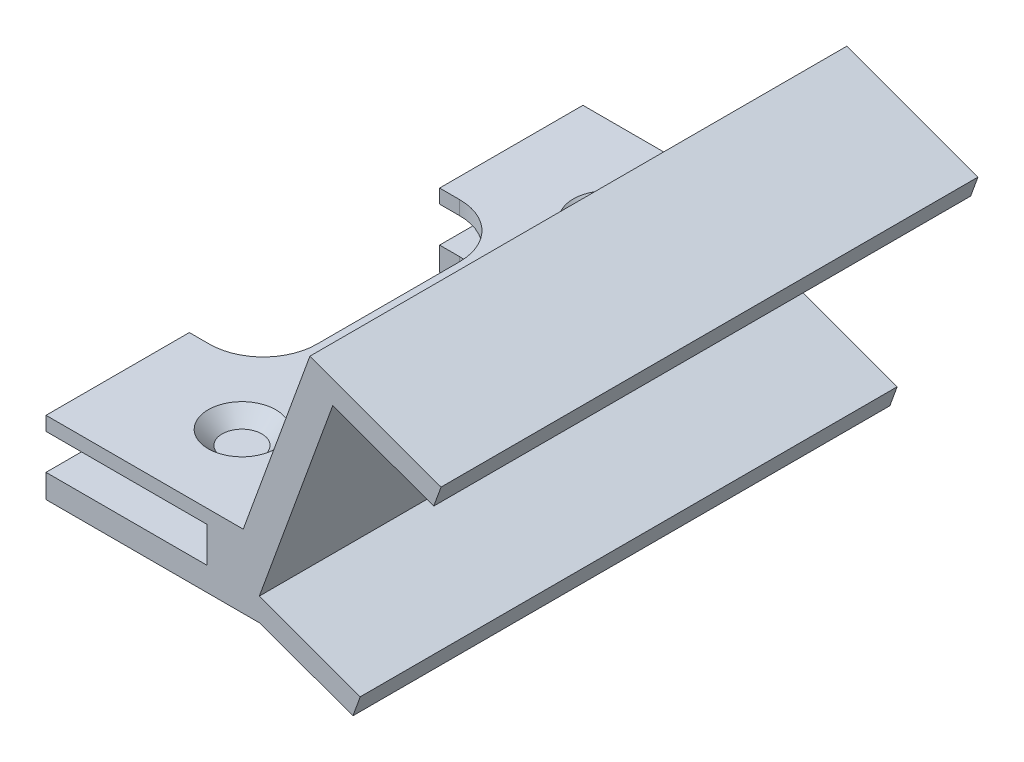
ISO-10303-21;
HEADER;
FILE_DESCRIPTION(('STEP AP214'),'2;1');
FILE_NAME('part.step','',(''),(''),'','','');
FILE_SCHEMA(('AUTOMOTIVE_DESIGN { 1 0 10303 214 1 1 1 1 }'));
ENDSEC;
DATA;
#1=APPLICATION_CONTEXT('core data for automotive mechanical design processes');
#2=APPLICATION_PROTOCOL_DEFINITION('international standard','automotive_design',2000,#1);
#3=PRODUCT_CONTEXT('',#1,'mechanical');
#4=PRODUCT('Part','Part','',(#3));
#5=PRODUCT_RELATED_PRODUCT_CATEGORY('part','',(#4));
#6=PRODUCT_DEFINITION_FORMATION('','',#4);
#7=PRODUCT_DEFINITION_CONTEXT('part definition',#1,'design');
#8=PRODUCT_DEFINITION('design','',#6,#7);
#9=PRODUCT_DEFINITION_SHAPE('','',#8);
#10=(LENGTH_UNIT() NAMED_UNIT(*) SI_UNIT(.MILLI.,.METRE.));
#11=(NAMED_UNIT(*) PLANE_ANGLE_UNIT() SI_UNIT($,.RADIAN.));
#12=(NAMED_UNIT(*) SI_UNIT($,.STERADIAN.) SOLID_ANGLE_UNIT());
#13=UNCERTAINTY_MEASURE_WITH_UNIT(LENGTH_MEASURE(1.E-05),#10,'distance_accuracy_value','');
#14=(GEOMETRIC_REPRESENTATION_CONTEXT(3) GLOBAL_UNCERTAINTY_ASSIGNED_CONTEXT((#13)) GLOBAL_UNIT_ASSIGNED_CONTEXT((#10,
#11,#12)) REPRESENTATION_CONTEXT('',''));
#15=CARTESIAN_POINT('',(0.,0.,0.));
#16=DIRECTION('',(0.,0.,1.));
#17=DIRECTION('',(1.,0.,0.));
#18=AXIS2_PLACEMENT_3D('',#15,#16,#17);
#19=CARTESIAN_POINT('',(10.8861694216917,21.6408290137137,50.));
#20=DIRECTION('',(1.,0.,0.));
#21=DIRECTION('',(0.,1.,0.));
#22=AXIS2_PLACEMENT_3D('',#19,#20,#21);
#23=PLANE('',#22);
#24=DIRECTION('',(0.,0.,-1.));
#25=VECTOR('',#24,1.);
#26=CARTESIAN_POINT('',(10.8861694216917,21.6408290137137,50.));
#27=LINE('',#26,#25);
#28=CARTESIAN_POINT('',(10.8861694216917,21.6408290137137,50.));
#29=VERTEX_POINT('',#28);
#30=CARTESIAN_POINT('',(10.8861694216917,21.6408290137137,36.6524051854797));
#31=VERTEX_POINT('',#30);
#32=EDGE_CURVE('E411',#29,#31,#27,.T.);
#33=ORIENTED_EDGE('',*,*,#32,.T.);
#34=DIRECTION('',(0.,-1.,0.));
#35=VECTOR('',#34,1.);
#36=CARTESIAN_POINT('',(10.8861694216917,21.6408290137137,36.6524051854797));
#37=LINE('',#36,#35);
#38=CARTESIAN_POINT('',(10.8861694216917,19.4408290137137,36.6524051854797));
#39=VERTEX_POINT('',#38);
#40=EDGE_CURVE('E229',#31,#39,#37,.T.);
#41=ORIENTED_EDGE('',*,*,#40,.T.);
#42=DIRECTION('',(0.,0.,-1.));
#43=VECTOR('',#42,1.);
#44=CARTESIAN_POINT('',(10.8861694216917,19.4408290137137,50.));
#45=LINE('',#44,#43);
#46=CARTESIAN_POINT('',(10.8861694216917,19.4408290137137,50.));
#47=VERTEX_POINT('',#46);
#48=EDGE_CURVE('E273',#47,#39,#45,.T.);
#49=ORIENTED_EDGE('',*,*,#48,.F.);
#50=DIRECTION('',(0.,-1.,0.));
#51=VECTOR('',#50,1.);
#52=CARTESIAN_POINT('',(10.8861694216917,21.6408290137137,50.));
#53=LINE('',#52,#51);
#54=EDGE_CURVE('E410',#29,#47,#53,.T.);
#55=ORIENTED_EDGE('',*,*,#54,.F.);
#56=EDGE_LOOP('',(#33,#41,#49,#55));
#57=FACE_BOUND('',#56,.T.);
#58=ADVANCED_FACE('F34',(#57),#23,.F.);
#59=CARTESIAN_POINT('',(10.8861694216917,26.2408290137137,50.));
#60=DIRECTION('',(1.,0.,0.));
#61=DIRECTION('',(0.,0.,-1.));
#62=AXIS2_PLACEMENT_3D('',#59,#60,#61);
#63=PLANE('',#62);
#64=DIRECTION('',(0.,0.,-1.));
#65=VECTOR('',#64,1.);
#66=CARTESIAN_POINT('',(10.8861694216917,26.2408290137137,50.));
#67=LINE('',#66,#65);
#68=CARTESIAN_POINT('',(10.8861694216917,26.2408290137137,50.));
#69=VERTEX_POINT('',#68);
#70=CARTESIAN_POINT('',(10.8861694216917,26.2408290137137,36.6524051854797));
#71=VERTEX_POINT('',#70);
#72=EDGE_CURVE('E238',#69,#71,#67,.T.);
#73=ORIENTED_EDGE('',*,*,#72,.T.);
#74=DIRECTION('',(0.,-1.,0.));
#75=VECTOR('',#74,1.);
#76=CARTESIAN_POINT('',(10.8861694216917,26.2408290137137,36.6524051854797));
#77=LINE('',#76,#75);
#78=CARTESIAN_POINT('',(10.8861694216917,24.9408290137137,36.6524051854797));
#79=VERTEX_POINT('',#78);
#80=EDGE_CURVE('E477',#71,#79,#77,.T.);
#81=ORIENTED_EDGE('',*,*,#80,.T.);
#82=DIRECTION('',(0.,0.,-1.));
#83=VECTOR('',#82,1.);
#84=CARTESIAN_POINT('',(10.8861694216917,24.9408290137137,50.));
#85=LINE('',#84,#83);
#86=CARTESIAN_POINT('',(10.8861694216917,24.9408290137137,50.));
#87=VERTEX_POINT('',#86);
#88=EDGE_CURVE('E239',#87,#79,#85,.T.);
#89=ORIENTED_EDGE('',*,*,#88,.F.);
#90=DIRECTION('',(0.,-1.,0.));
#91=VECTOR('',#90,1.);
#92=CARTESIAN_POINT('',(10.8861694216917,26.2408290137137,50.));
#93=LINE('',#92,#91);
#94=EDGE_CURVE('E439',#69,#87,#93,.T.);
#95=ORIENTED_EDGE('',*,*,#94,.F.);
#96=EDGE_LOOP('',(#73,#81,#89,#95));
#97=FACE_BOUND('',#96,.T.);
#98=ADVANCED_FACE('F340',(#97),#63,.F.);
#99=CARTESIAN_POINT('',(10.8861694216917,19.4408290137137,13.3475948145203));
#100=VERTEX_POINT('',#99);
#101=CARTESIAN_POINT('',(10.8861694216917,19.4408290137137,0.));
#102=VERTEX_POINT('',#101);
#103=EDGE_CURVE('E272',#100,#102,#45,.T.);
#104=ORIENTED_EDGE('',*,*,#103,.F.);
#105=DIRECTION('',(0.,1.,0.));
#106=VECTOR('',#105,1.);
#107=CARTESIAN_POINT('',(10.8861694216917,21.6408290137137,13.3475948145203));
#108=LINE('',#107,#106);
#109=CARTESIAN_POINT('',(10.8861694216917,21.6408290137137,13.3475948145203));
#110=VERTEX_POINT('',#109);
#111=EDGE_CURVE('E364',#100,#110,#108,.T.);
#112=ORIENTED_EDGE('',*,*,#111,.T.);
#113=CARTESIAN_POINT('',(10.8861694216917,21.6408290137137,0.));
#114=VERTEX_POINT('',#113);
#115=EDGE_CURVE('E414',#110,#114,#27,.T.);
#116=ORIENTED_EDGE('',*,*,#115,.T.);
#117=DIRECTION('',(0.,-1.,0.));
#118=VECTOR('',#117,1.);
#119=CARTESIAN_POINT('',(10.8861694216917,21.6408290137137,0.));
#120=LINE('',#119,#118);
#121=EDGE_CURVE('E367',#114,#102,#120,.T.);
#122=ORIENTED_EDGE('',*,*,#121,.T.);
#123=EDGE_LOOP('',(#104,#112,#116,#122));
#124=FACE_BOUND('',#123,.T.);
#125=ADVANCED_FACE('F343',(#124),#23,.F.);
#126=CARTESIAN_POINT('',(10.8861694216917,19.4408290137137,50.));
#127=DIRECTION('',(0.,1.,0.));
#128=DIRECTION('',(0.,0.,1.));
#129=AXIS2_PLACEMENT_3D('',#126,#127,#128);
#130=PLANE('',#129);
#131=CARTESIAN_POINT('',(21.1361694216917,19.4408290137137,8.));
#132=DIRECTION('',(0.,1.,0.));
#133=DIRECTION('',(0.,0.,1.));
#134=AXIS2_PLACEMENT_3D('',#131,#132,#133);
#135=CIRCLE('',#134,1.7);
#136=CARTESIAN_POINT('',(21.1361694216917,19.4408290137137,9.7));
#137=VERTEX_POINT('',#136);
#138=EDGE_CURVE('E285',#137,#137,#135,.T.);
#139=ORIENTED_EDGE('',*,*,#138,.T.);
#140=EDGE_LOOP('',(#139));
#141=FACE_BOUND('',#140,.T.);
#142=CARTESIAN_POINT('',(21.1361694216917,19.4408290137137,42.));
#143=DIRECTION('',(0.,1.,0.));
#144=DIRECTION('',(0.,0.,1.));
#145=AXIS2_PLACEMENT_3D('',#142,#143,#144);
#146=CIRCLE('',#145,1.7);
#147=CARTESIAN_POINT('',(21.1361694216917,19.4408290137137,43.7));
#148=VERTEX_POINT('',#147);
#149=EDGE_CURVE('E280',#148,#148,#146,.T.);
#150=ORIENTED_EDGE('',*,*,#149,.T.);
#151=EDGE_LOOP('',(#150));
#152=FACE_BOUND('',#151,.T.);
#153=ORIENTED_EDGE('',*,*,#48,.T.);
#154=DIRECTION('',(1.,0.,0.));
#155=VECTOR('',#154,1.);
#156=CARTESIAN_POINT('',(10.8861694216917,19.4408290137137,36.6524051854797));
#157=LINE('',#156,#155);
#158=CARTESIAN_POINT('',(12.7611694216917,19.4408290137137,36.6524051854797));
#159=VERTEX_POINT('',#158);
#160=EDGE_CURVE('E483',#39,#159,#157,.T.);
#161=ORIENTED_EDGE('',*,*,#160,.T.);
#162=CARTESIAN_POINT('',(12.7611694216917,19.4408290137137,31.6524051854797));
#163=DIRECTION('',(0.,1.,0.));
#164=DIRECTION('',(0.,0.,1.));
#165=AXIS2_PLACEMENT_3D('',#162,#163,#164);
#166=CIRCLE('',#165,5.);
#167=CARTESIAN_POINT('',(17.7611694216917,19.4408290137137,31.6524051854797));
#168=VERTEX_POINT('',#167);
#169=EDGE_CURVE('E317',#159,#168,#166,.T.);
#170=ORIENTED_EDGE('',*,*,#169,.T.);
#171=DIRECTION('',(0.,0.,-1.));
#172=VECTOR('',#171,1.);
#173=CARTESIAN_POINT('',(17.7611694216917,19.4408290137137,50.));
#174=LINE('',#173,#172);
#175=CARTESIAN_POINT('',(17.7611694216917,19.4408290137137,18.3475948145203));
#176=VERTEX_POINT('',#175);
#177=EDGE_CURVE('E472',#168,#176,#174,.T.);
#178=ORIENTED_EDGE('',*,*,#177,.T.);
#179=CARTESIAN_POINT('',(12.7611694216917,19.4408290137137,18.3475948145203));
#180=DIRECTION('',(0.,1.,0.));
#181=DIRECTION('',(0.,0.,1.));
#182=AXIS2_PLACEMENT_3D('',#179,#180,#181);
#183=CIRCLE('',#182,5.);
#184=CARTESIAN_POINT('',(12.7611694216917,19.4408290137137,13.3475948145203));
#185=VERTEX_POINT('',#184);
#186=EDGE_CURVE('E325',#176,#185,#183,.T.);
#187=ORIENTED_EDGE('',*,*,#186,.T.);
#188=DIRECTION('',(-1.,0.,0.));
#189=VECTOR('',#188,1.);
#190=CARTESIAN_POINT('',(10.8861694216917,19.4408290137137,13.3475948145203));
#191=LINE('',#190,#189);
#192=EDGE_CURVE('E373',#185,#100,#191,.T.);
#193=ORIENTED_EDGE('',*,*,#192,.T.);
#194=ORIENTED_EDGE('',*,*,#103,.T.);
#195=DIRECTION('',(1.,0.,0.));
#196=VECTOR('',#195,1.);
#197=CARTESIAN_POINT('',(10.8861694216917,19.4408290137137,0.));
#198=LINE('',#197,#196);
#199=CARTESIAN_POINT('',(30.820361380704,19.4408290137137,0.));
#200=VERTEX_POINT('',#199);
#201=EDGE_CURVE('E371',#102,#200,#198,.T.);
#202=ORIENTED_EDGE('',*,*,#201,.T.);
#203=DIRECTION('',(0.,0.,-1.));
#204=VECTOR('',#203,1.);
#205=CARTESIAN_POINT('',(30.820361380704,19.4408290137137,50.));
#206=LINE('',#205,#204);
#207=CARTESIAN_POINT('',(30.820361380704,19.4408290137137,50.));
#208=VERTEX_POINT('',#207);
#209=EDGE_CURVE('E269',#208,#200,#206,.T.);
#210=ORIENTED_EDGE('',*,*,#209,.F.);
#211=DIRECTION('',(1.,0.,0.));
#212=VECTOR('',#211,1.);
#213=CARTESIAN_POINT('',(10.8861694216917,19.4408290137137,50.));
#214=LINE('',#213,#212);
#215=EDGE_CURVE('E459',#47,#208,#214,.T.);
#216=ORIENTED_EDGE('',*,*,#215,.F.);
#217=EDGE_LOOP('',(#153,#161,#170,#178,#187,#193,#194,#202,#210,#216));
#218=FACE_BOUND('',#217,.T.);
#219=ADVANCED_FACE('F353',(#141,#152,#218),#130,.F.);
#220=CARTESIAN_POINT('',(30.820361380704,19.4408290137137,50.));
#221=DIRECTION('',(0.34202014332567,0.939692620785908,0.));
#222=DIRECTION('',(-0.939692620785908,0.34202014332567,0.));
#223=AXIS2_PLACEMENT_3D('',#220,#221,#222);
#224=PLANE('',#223);
#225=DIRECTION('',(0.939692620785908,-0.34202014332567,0.));
#226=VECTOR('',#225,1.);
#227=CARTESIAN_POINT('',(30.820361380704,19.4408290137137,0.));
#228=LINE('',#227,#226);
#229=CARTESIAN_POINT('',(39.4657370752283,16.2941695968583,0.));
#230=VERTEX_POINT('',#229);
#231=EDGE_CURVE('E379',#200,#230,#228,.T.);
#232=ORIENTED_EDGE('',*,*,#231,.T.);
#233=DIRECTION('',(0.,0.,-1.));
#234=VECTOR('',#233,1.);
#235=CARTESIAN_POINT('',(39.4657370752283,16.2941695968583,50.));
#236=LINE('',#235,#234);
#237=CARTESIAN_POINT('',(39.4657370752283,16.2941695968583,50.));
#238=VERTEX_POINT('',#237);
#239=EDGE_CURVE('E266',#238,#230,#236,.T.);
#240=ORIENTED_EDGE('',*,*,#239,.F.);
#241=DIRECTION('',(0.939692620785908,-0.34202014332567,0.));
#242=VECTOR('',#241,1.);
#243=CARTESIAN_POINT('',(30.820361380704,19.4408290137137,50.));
#244=LINE('',#243,#242);
#245=EDGE_CURVE('E457',#208,#238,#244,.T.);
#246=ORIENTED_EDGE('',*,*,#245,.F.);
#247=ORIENTED_EDGE('',*,*,#209,.T.);
#248=EDGE_LOOP('',(#232,#240,#246,#247));
#249=FACE_BOUND('',#248,.T.);
#250=ADVANCED_FACE('F358',(#249),#224,.F.);
#251=CARTESIAN_POINT('',(39.4657370752283,16.2941695968583,50.));
#252=DIRECTION('',(-0.93969262078591,0.342020143325666,0.));
#253=DIRECTION('',(-0.342020143325666,-0.93969262078591,0.));
#254=AXIS2_PLACEMENT_3D('',#251,#252,#253);
#255=PLANE('',#254);
#256=DIRECTION('',(0.342020143325666,0.939692620785909,0.));
#257=VECTOR('',#256,1.);
#258=CARTESIAN_POINT('',(39.4657370752283,16.2941695968583,0.));
#259=LINE('',#258,#257);
#260=CARTESIAN_POINT('',(40.1497773618796,18.1735548384301,0.));
#261=VERTEX_POINT('',#260);
#262=EDGE_CURVE('E381',#230,#261,#259,.T.);
#263=ORIENTED_EDGE('',*,*,#262,.T.);
#264=DIRECTION('',(0.,0.,-1.));
#265=VECTOR('',#264,1.);
#266=CARTESIAN_POINT('',(40.1497773618796,18.1735548384301,50.));
#267=LINE('',#266,#265);
#268=CARTESIAN_POINT('',(40.1497773618796,18.1735548384301,50.));
#269=VERTEX_POINT('',#268);
#270=EDGE_CURVE('E263',#269,#261,#267,.T.);
#271=ORIENTED_EDGE('',*,*,#270,.F.);
#272=DIRECTION('',(0.342020143325666,0.939692620785909,0.));
#273=VECTOR('',#272,1.);
#274=CARTESIAN_POINT('',(39.4657370752283,16.2941695968583,50.));
#275=LINE('',#274,#273);
#276=EDGE_CURVE('E455',#238,#269,#275,.T.);
#277=ORIENTED_EDGE('',*,*,#276,.F.);
#278=ORIENTED_EDGE('',*,*,#239,.T.);
#279=EDGE_LOOP('',(#263,#271,#277,#278));
#280=FACE_BOUND('',#279,.T.);
#281=ADVANCED_FACE('F537',(#280),#255,.F.);
#282=CARTESIAN_POINT('',(40.1497773618796,18.1735548384301,50.));
#283=DIRECTION('',(-0.342020143325664,-0.93969262078591,0.));
#284=DIRECTION('',(0.93969262078591,-0.342020143325664,0.));
#285=AXIS2_PLACEMENT_3D('',#282,#283,#284);
#286=PLANE('',#285);
#287=DIRECTION('',(-0.93969262078591,0.342020143325664,0.));
#288=VECTOR('',#287,1.);
#289=CARTESIAN_POINT('',(40.1497773618796,18.1735548384301,0.));
#290=LINE('',#289,#288);
#291=CARTESIAN_POINT('',(30.7528511540205,21.5937562716868,0.));
#292=VERTEX_POINT('',#291);
#293=EDGE_CURVE('E388',#261,#292,#290,.T.);
#294=ORIENTED_EDGE('',*,*,#293,.T.);
#295=DIRECTION('',(0.,0.,-1.));
#296=VECTOR('',#295,1.);
#297=CARTESIAN_POINT('',(30.7528511540205,21.5937562716868,50.));
#298=LINE('',#297,#296);
#299=CARTESIAN_POINT('',(30.7528511540205,21.5937562716868,50.));
#300=VERTEX_POINT('',#299);
#301=EDGE_CURVE('E260',#300,#292,#298,.T.);
#302=ORIENTED_EDGE('',*,*,#301,.F.);
#303=DIRECTION('',(-0.93969262078591,0.342020143325664,0.));
#304=VECTOR('',#303,1.);
#305=CARTESIAN_POINT('',(40.1497773618796,18.1735548384301,50.));
#306=LINE('',#305,#304);
#307=EDGE_CURVE('E453',#269,#300,#306,.T.);
#308=ORIENTED_EDGE('',*,*,#307,.F.);
#309=ORIENTED_EDGE('',*,*,#270,.T.);
#310=EDGE_LOOP('',(#294,#302,#308,#309));
#311=FACE_BOUND('',#310,.T.);
#312=ADVANCED_FACE('F533',(#311),#286,.F.);
#313=CARTESIAN_POINT('',(30.7528511540205,21.5937562716868,50.));
#314=DIRECTION('',(-0.93969262078591,0.342020143325664,0.));
#315=DIRECTION('',(-0.342020143325664,-0.93969262078591,0.));
#316=AXIS2_PLACEMENT_3D('',#313,#314,#315);
#317=PLANE('',#316);
#318=DIRECTION('',(0.342020143325664,0.93969262078591,0.));
#319=VECTOR('',#318,1.);
#320=CARTESIAN_POINT('',(30.7528511540205,21.5937562716868,0.));
#321=LINE('',#320,#319);
#322=CARTESIAN_POINT('',(37.5932540205338,40.387608687405,0.));
#323=VERTEX_POINT('',#322);
#324=EDGE_CURVE('E390',#292,#323,#321,.T.);
#325=ORIENTED_EDGE('',*,*,#324,.T.);
#326=DIRECTION('',(0.,0.,-1.));
#327=VECTOR('',#326,1.);
#328=CARTESIAN_POINT('',(37.5932540205338,40.387608687405,50.));
#329=LINE('',#328,#327);
#330=CARTESIAN_POINT('',(37.5932540205338,40.387608687405,50.));
#331=VERTEX_POINT('',#330);
#332=EDGE_CURVE('E257',#331,#323,#329,.T.);
#333=ORIENTED_EDGE('',*,*,#332,.F.);
#334=DIRECTION('',(0.342020143325664,0.93969262078591,0.));
#335=VECTOR('',#334,1.);
#336=CARTESIAN_POINT('',(30.7528511540205,21.5937562716868,50.));
#337=LINE('',#336,#335);
#338=EDGE_CURVE('E451',#300,#331,#337,.T.);
#339=ORIENTED_EDGE('',*,*,#338,.F.);
#340=ORIENTED_EDGE('',*,*,#301,.T.);
#341=EDGE_LOOP('',(#325,#333,#339,#340));
#342=FACE_BOUND('',#341,.T.);
#343=ADVANCED_FACE('F528',(#342),#317,.F.);
#344=CARTESIAN_POINT('',(37.5932540205338,40.387608687405,50.));
#345=DIRECTION('',(0.342020143325664,0.93969262078591,0.));
#346=DIRECTION('',(-0.93969262078591,0.342020143325664,0.));
#347=AXIS2_PLACEMENT_3D('',#344,#345,#346);
#348=PLANE('',#347);
#349=DIRECTION('',(0.93969262078591,-0.342020143325664,0.));
#350=VECTOR('',#349,1.);
#351=CARTESIAN_POINT('',(37.5932540205338,40.387608687405,0.));
#352=LINE('',#351,#350);
#353=CARTESIAN_POINT('',(46.9901802283929,36.9674072541483,0.));
#354=VERTEX_POINT('',#353);
#355=EDGE_CURVE('E392',#323,#354,#352,.T.);
#356=ORIENTED_EDGE('',*,*,#355,.T.);
#357=DIRECTION('',(0.,0.,-1.));
#358=VECTOR('',#357,1.);
#359=CARTESIAN_POINT('',(46.9901802283929,36.9674072541483,50.));
#360=LINE('',#359,#358);
#361=CARTESIAN_POINT('',(46.9901802283929,36.9674072541483,50.));
#362=VERTEX_POINT('',#361);
#363=EDGE_CURVE('E254',#362,#354,#360,.T.);
#364=ORIENTED_EDGE('',*,*,#363,.F.);
#365=DIRECTION('',(0.93969262078591,-0.342020143325664,0.));
#366=VECTOR('',#365,1.);
#367=CARTESIAN_POINT('',(37.5932540205338,40.387608687405,50.));
#368=LINE('',#367,#366);
#369=EDGE_CURVE('E449',#331,#362,#368,.T.);
#370=ORIENTED_EDGE('',*,*,#369,.F.);
#371=ORIENTED_EDGE('',*,*,#332,.T.);
#372=EDGE_LOOP('',(#356,#364,#370,#371));
#373=FACE_BOUND('',#372,.T.);
#374=ADVANCED_FACE('F523',(#373),#348,.F.);
#375=CARTESIAN_POINT('',(46.9901802283929,36.9674072541483,50.));
#376=DIRECTION('',(-0.93969262078591,0.342020143325664,0.));
#377=DIRECTION('',(-0.342020143325664,-0.93969262078591,0.));
#378=AXIS2_PLACEMENT_3D('',#375,#376,#377);
#379=PLANE('',#378);
#380=DIRECTION('',(0.342020143325664,0.93969262078591,0.));
#381=VECTOR('',#380,1.);
#382=CARTESIAN_POINT('',(46.9901802283929,36.9674072541483,0.));
#383=LINE('',#382,#381);
#384=CARTESIAN_POINT('',(47.6742205150442,38.8467924957202,0.));
#385=VERTEX_POINT('',#384);
#386=EDGE_CURVE('E394',#354,#385,#383,.T.);
#387=ORIENTED_EDGE('',*,*,#386,.T.);
#388=DIRECTION('',(0.,0.,-1.));
#389=VECTOR('',#388,1.);
#390=CARTESIAN_POINT('',(47.6742205150442,38.8467924957202,50.));
#391=LINE('',#390,#389);
#392=CARTESIAN_POINT('',(47.6742205150442,38.8467924957202,50.));
#393=VERTEX_POINT('',#392);
#394=EDGE_CURVE('E251',#393,#385,#391,.T.);
#395=ORIENTED_EDGE('',*,*,#394,.F.);
#396=DIRECTION('',(0.342020143325664,0.93969262078591,0.));
#397=VECTOR('',#396,1.);
#398=CARTESIAN_POINT('',(46.9901802283929,36.9674072541483,50.));
#399=LINE('',#398,#397);
#400=EDGE_CURVE('E447',#362,#393,#399,.T.);
#401=ORIENTED_EDGE('',*,*,#400,.F.);
#402=ORIENTED_EDGE('',*,*,#363,.T.);
#403=EDGE_LOOP('',(#387,#395,#401,#402));
#404=FACE_BOUND('',#403,.T.);
#405=ADVANCED_FACE('F519',(#404),#379,.F.);
#406=CARTESIAN_POINT('',(47.6742205150442,38.8467924957202,50.));
#407=DIRECTION('',(-0.342020143325664,-0.93969262078591,0.));
#408=DIRECTION('',(0.93969262078591,-0.342020143325664,0.));
#409=AXIS2_PLACEMENT_3D('',#406,#407,#408);
#410=PLANE('',#409);
#411=DIRECTION('',(-0.93969262078591,0.342020143325664,0.));
#412=VECTOR('',#411,1.);
#413=CARTESIAN_POINT('',(47.6742205150442,38.8467924957202,0.));
#414=LINE('',#413,#412);
#415=CARTESIAN_POINT('',(35.4582164448274,43.2930543589538,0.));
#416=VERTEX_POINT('',#415);
#417=EDGE_CURVE('E396',#385,#416,#414,.T.);
#418=ORIENTED_EDGE('',*,*,#417,.T.);
#419=DIRECTION('',(0.,0.,-1.));
#420=VECTOR('',#419,1.);
#421=CARTESIAN_POINT('',(35.4582164448274,43.2930543589538,50.));
#422=LINE('',#421,#420);
#423=CARTESIAN_POINT('',(35.4582164448274,43.2930543589538,50.));
#424=VERTEX_POINT('',#423);
#425=EDGE_CURVE('E248',#424,#416,#422,.T.);
#426=ORIENTED_EDGE('',*,*,#425,.F.);
#427=DIRECTION('',(-0.93969262078591,0.342020143325664,0.));
#428=VECTOR('',#427,1.);
#429=CARTESIAN_POINT('',(47.6742205150442,38.8467924957202,50.));
#430=LINE('',#429,#428);
#431=EDGE_CURVE('E445',#393,#424,#430,.T.);
#432=ORIENTED_EDGE('',*,*,#431,.F.);
#433=ORIENTED_EDGE('',*,*,#394,.T.);
#434=EDGE_LOOP('',(#418,#426,#432,#433));
#435=FACE_BOUND('',#434,.T.);
#436=ADVANCED_FACE('F515',(#435),#410,.F.);
#437=CARTESIAN_POINT('',(35.4582164448274,43.2930543589538,50.));
#438=DIRECTION('',(0.93969262078591,-0.342020143325664,0.));
#439=DIRECTION('',(0.342020143325664,0.93969262078591,0.));
#440=AXIS2_PLACEMENT_3D('',#437,#438,#439);
#441=PLANE('',#440);
#442=DIRECTION('',(-0.342020143325664,-0.93969262078591,0.));
#443=VECTOR('',#442,1.);
#444=CARTESIAN_POINT('',(35.4582164448274,43.2930543589538,0.));
#445=LINE('',#444,#443);
#446=CARTESIAN_POINT('',(29.2517139911604,26.2408290137137,0.));
#447=VERTEX_POINT('',#446);
#448=EDGE_CURVE('E398',#416,#447,#445,.T.);
#449=ORIENTED_EDGE('',*,*,#448,.T.);
#450=DIRECTION('',(0.,0.,-1.));
#451=VECTOR('',#450,1.);
#452=CARTESIAN_POINT('',(29.2517139911604,26.2408290137137,50.));
#453=LINE('',#452,#451);
#454=CARTESIAN_POINT('',(29.2517139911604,26.2408290137137,50.));
#455=VERTEX_POINT('',#454);
#456=EDGE_CURVE('E242',#455,#447,#453,.T.);
#457=ORIENTED_EDGE('',*,*,#456,.F.);
#458=DIRECTION('',(-0.342020143325664,-0.93969262078591,0.));
#459=VECTOR('',#458,1.);
#460=CARTESIAN_POINT('',(35.4582164448274,43.2930543589538,50.));
#461=LINE('',#460,#459);
#462=EDGE_CURVE('E443',#424,#455,#461,.T.);
#463=ORIENTED_EDGE('',*,*,#462,.F.);
#464=ORIENTED_EDGE('',*,*,#425,.T.);
#465=EDGE_LOOP('',(#449,#457,#463,#464));
#466=FACE_BOUND('',#465,.T.);
#467=ADVANCED_FACE('F509',(#466),#441,.F.);
#468=CARTESIAN_POINT('',(29.2517139911604,26.2408290137137,50.));
#469=DIRECTION('',(0.,-1.,0.));
#470=DIRECTION('',(1.,0.,0.));
#471=AXIS2_PLACEMENT_3D('',#468,#469,#470);
#472=PLANE('',#471);
#473=CARTESIAN_POINT('',(21.1361694216917,26.2408290137137,8.));
#474=DIRECTION('',(0.,1.,0.));
#475=DIRECTION('',(0.,0.,1.));
#476=AXIS2_PLACEMENT_3D('',#473,#474,#475);
#477=CIRCLE('',#476,3.15);
#478=CARTESIAN_POINT('',(21.1361694216917,26.2408290137137,11.15));
#479=VERTEX_POINT('',#478);
#480=EDGE_CURVE('E286',#479,#479,#477,.T.);
#481=ORIENTED_EDGE('',*,*,#480,.F.);
#482=EDGE_LOOP('',(#481));
#483=FACE_BOUND('',#482,.T.);
#484=CARTESIAN_POINT('',(21.1361694216917,26.2408290137137,42.));
#485=DIRECTION('',(0.,1.,0.));
#486=DIRECTION('',(0.,0.,1.));
#487=AXIS2_PLACEMENT_3D('',#484,#485,#486);
#488=CIRCLE('',#487,3.15);
#489=CARTESIAN_POINT('',(21.1361694216917,26.2408290137137,45.15));
#490=VERTEX_POINT('',#489);
#491=EDGE_CURVE('E281',#490,#490,#488,.T.);
#492=ORIENTED_EDGE('',*,*,#491,.F.);
#493=EDGE_LOOP('',(#492));
#494=FACE_BOUND('',#493,.T.);
#495=DIRECTION('',(0.,0.,-1.));
#496=VECTOR('',#495,1.);
#497=CARTESIAN_POINT('',(17.7611694216917,26.2408290137137,13.3475948145203));
#498=LINE('',#497,#496);
#499=CARTESIAN_POINT('',(17.7611694216917,26.2408290137137,31.6524051854797));
#500=VERTEX_POINT('',#499);
#501=CARTESIAN_POINT('',(17.7611694216917,26.2408290137137,18.3475948145203));
#502=VERTEX_POINT('',#501);
#503=EDGE_CURVE('E221',#500,#502,#498,.T.);
#504=ORIENTED_EDGE('',*,*,#503,.F.);
#505=CARTESIAN_POINT('',(12.7611694216917,26.2408290137137,31.6524051854797));
#506=DIRECTION('',(0.,-1.,0.));
#507=DIRECTION('',(1.,0.,0.));
#508=AXIS2_PLACEMENT_3D('',#505,#506,#507);
#509=CIRCLE('',#508,5.);
#510=CARTESIAN_POINT('',(12.7611694216917,26.2408290137137,36.6524051854797));
#511=VERTEX_POINT('',#510);
#512=EDGE_CURVE('E319',#500,#511,#509,.T.);
#513=ORIENTED_EDGE('',*,*,#512,.T.);
#514=DIRECTION('',(1.,0.,0.));
#515=VECTOR('',#514,1.);
#516=CARTESIAN_POINT('',(4.01116942169173,26.2408290137137,36.6524051854797));
#517=LINE('',#516,#515);
#518=EDGE_CURVE('E220',#71,#511,#517,.T.);
#519=ORIENTED_EDGE('',*,*,#518,.F.);
#520=ORIENTED_EDGE('',*,*,#72,.F.);
#521=DIRECTION('',(-1.,0.,0.));
#522=VECTOR('',#521,1.);
#523=CARTESIAN_POINT('',(29.2517139911604,26.2408290137137,50.));
#524=LINE('',#523,#522);
#525=EDGE_CURVE('E441',#455,#69,#524,.T.);
#526=ORIENTED_EDGE('',*,*,#525,.F.);
#527=ORIENTED_EDGE('',*,*,#456,.T.);
#528=DIRECTION('',(-1.,0.,0.));
#529=VECTOR('',#528,1.);
#530=CARTESIAN_POINT('',(29.2517139911604,26.2408290137137,0.));
#531=LINE('',#530,#529);
#532=CARTESIAN_POINT('',(10.8861694216917,26.2408290137137,0.));
#533=VERTEX_POINT('',#532);
#534=EDGE_CURVE('E236',#447,#533,#531,.T.);
#535=ORIENTED_EDGE('',*,*,#534,.T.);
#536=CARTESIAN_POINT('',(10.8861694216917,26.2408290137137,13.3475948145203));
#537=VERTEX_POINT('',#536);
#538=EDGE_CURVE('E226',#537,#533,#67,.T.);
#539=ORIENTED_EDGE('',*,*,#538,.F.);
#540=DIRECTION('',(-1.,0.,0.));
#541=VECTOR('',#540,1.);
#542=CARTESIAN_POINT('',(4.01116942169173,26.2408290137137,13.3475948145203));
#543=LINE('',#542,#541);
#544=CARTESIAN_POINT('',(12.7611694216917,26.2408290137137,13.3475948145203));
#545=VERTEX_POINT('',#544);
#546=EDGE_CURVE('E212',#545,#537,#543,.T.);
#547=ORIENTED_EDGE('',*,*,#546,.F.);
#548=CARTESIAN_POINT('',(12.7611694216917,26.2408290137137,18.3475948145203));
#549=DIRECTION('',(0.,-1.,0.));
#550=DIRECTION('',(1.,0.,0.));
#551=AXIS2_PLACEMENT_3D('',#548,#549,#550);
#552=CIRCLE('',#551,5.);
#553=EDGE_CURVE('E42',#545,#502,#552,.T.);
#554=ORIENTED_EDGE('',*,*,#553,.T.);
#555=EDGE_LOOP('',(#504,#513,#519,#520,#526,#527,#535,#539,#547,#554));
#556=FACE_BOUND('',#555,.T.);
#557=ADVANCED_FACE('F233',(#483,#494,#556),#472,.F.);
#558=CARTESIAN_POINT('',(10.8861694216917,24.9408290137137,13.3475948145203));
#559=VERTEX_POINT('',#558);
#560=CARTESIAN_POINT('',(10.8861694216917,24.9408290137137,0.));
#561=VERTEX_POINT('',#560);
#562=EDGE_CURVE('E228',#559,#561,#85,.T.);
#563=ORIENTED_EDGE('',*,*,#562,.F.);
#564=DIRECTION('',(0.,1.,0.));
#565=VECTOR('',#564,1.);
#566=CARTESIAN_POINT('',(10.8861694216917,26.2408290137137,13.3475948145203));
#567=LINE('',#566,#565);
#568=EDGE_CURVE('E215',#559,#537,#567,.T.);
#569=ORIENTED_EDGE('',*,*,#568,.T.);
#570=ORIENTED_EDGE('',*,*,#538,.T.);
#571=DIRECTION('',(0.,-1.,0.));
#572=VECTOR('',#571,1.);
#573=CARTESIAN_POINT('',(10.8861694216917,26.2408290137137,0.));
#574=LINE('',#573,#572);
#575=EDGE_CURVE('E401',#533,#561,#574,.T.);
#576=ORIENTED_EDGE('',*,*,#575,.T.);
#577=EDGE_LOOP('',(#563,#569,#570,#576));
#578=FACE_BOUND('',#577,.T.);
#579=ADVANCED_FACE('F224',(#578),#63,.F.);
#580=CARTESIAN_POINT('',(25.8861694216917,24.9408290137137,50.));
#581=DIRECTION('',(0.,1.,0.));
#582=DIRECTION('',(-1.,0.,0.));
#583=AXIS2_PLACEMENT_3D('',#580,#581,#582);
#584=PLANE('',#583);
#585=CARTESIAN_POINT('',(21.1361694216917,24.9408290137137,8.));
#586=DIRECTION('',(0.,1.,0.));
#587=DIRECTION('',(-1.,0.,0.));
#588=AXIS2_PLACEMENT_3D('',#585,#586,#587);
#589=CIRCLE('',#588,1.85000000000001);
#590=CARTESIAN_POINT('',(19.2861694216917,24.9408290137137,8.));
#591=VERTEX_POINT('',#590);
#592=EDGE_CURVE('E287',#591,#591,#589,.T.);
#593=ORIENTED_EDGE('',*,*,#592,.T.);
#594=EDGE_LOOP('',(#593));
#595=FACE_BOUND('',#594,.T.);
#596=CARTESIAN_POINT('',(21.1361694216917,24.9408290137137,42.));
#597=DIRECTION('',(0.,1.,0.));
#598=DIRECTION('',(-1.,0.,0.));
#599=AXIS2_PLACEMENT_3D('',#596,#597,#598);
#600=CIRCLE('',#599,1.85000000000001);
#601=CARTESIAN_POINT('',(19.2861694216917,24.9408290137137,42.));
#602=VERTEX_POINT('',#601);
#603=EDGE_CURVE('E383',#602,#602,#600,.T.);
#604=ORIENTED_EDGE('',*,*,#603,.T.);
#605=EDGE_LOOP('',(#604));
#606=FACE_BOUND('',#605,.T.);
#607=ORIENTED_EDGE('',*,*,#88,.T.);
#608=DIRECTION('',(1.,0.,0.));
#609=VECTOR('',#608,1.);
#610=CARTESIAN_POINT('',(25.8861694216917,24.9408290137137,36.6524051854797));
#611=LINE('',#610,#609);
#612=CARTESIAN_POINT('',(12.7611694216917,24.9408290137137,36.6524051854797));
#613=VERTEX_POINT('',#612);
#614=EDGE_CURVE('E480',#79,#613,#611,.T.);
#615=ORIENTED_EDGE('',*,*,#614,.T.);
#616=CARTESIAN_POINT('',(12.7611694216917,24.9408290137137,31.6524051854797));
#617=DIRECTION('',(0.,1.,0.));
#618=DIRECTION('',(-1.,0.,0.));
#619=AXIS2_PLACEMENT_3D('',#616,#617,#618);
#620=CIRCLE('',#619,5.);
#621=CARTESIAN_POINT('',(17.7611694216917,24.9408290137137,31.6524051854797));
#622=VERTEX_POINT('',#621);
#623=EDGE_CURVE('E321',#613,#622,#620,.T.);
#624=ORIENTED_EDGE('',*,*,#623,.T.);
#625=DIRECTION('',(0.,0.,-1.));
#626=VECTOR('',#625,1.);
#627=CARTESIAN_POINT('',(17.7611694216917,24.9408290137137,50.));
#628=LINE('',#627,#626);
#629=CARTESIAN_POINT('',(17.7611694216917,24.9408290137137,18.3475948145203));
#630=VERTEX_POINT('',#629);
#631=EDGE_CURVE('E475',#622,#630,#628,.T.);
#632=ORIENTED_EDGE('',*,*,#631,.T.);
#633=CARTESIAN_POINT('',(12.7611694216917,24.9408290137137,18.3475948145203));
#634=DIRECTION('',(0.,1.,0.));
#635=DIRECTION('',(-1.,0.,0.));
#636=AXIS2_PLACEMENT_3D('',#633,#634,#635);
#637=CIRCLE('',#636,5.);
#638=CARTESIAN_POINT('',(12.7611694216917,24.9408290137137,13.3475948145203));
#639=VERTEX_POINT('',#638);
#640=EDGE_CURVE('E11',#630,#639,#637,.T.);
#641=ORIENTED_EDGE('',*,*,#640,.T.);
#642=DIRECTION('',(-1.,0.,0.));
#643=VECTOR('',#642,1.);
#644=CARTESIAN_POINT('',(25.8861694216917,24.9408290137137,13.3475948145203));
#645=LINE('',#644,#643);
#646=EDGE_CURVE('E230',#639,#559,#645,.T.);
#647=ORIENTED_EDGE('',*,*,#646,.T.);
#648=ORIENTED_EDGE('',*,*,#562,.T.);
#649=DIRECTION('',(1.,0.,0.));
#650=VECTOR('',#649,1.);
#651=CARTESIAN_POINT('',(25.8861694216917,24.9408290137137,0.));
#652=LINE('',#651,#650);
#653=CARTESIAN_POINT('',(25.8861694216917,24.9408290137137,0.));
#654=VERTEX_POINT('',#653);
#655=EDGE_CURVE('E403',#561,#654,#652,.T.);
#656=ORIENTED_EDGE('',*,*,#655,.T.);
#657=DIRECTION('',(0.,0.,-1.));
#658=VECTOR('',#657,1.);
#659=CARTESIAN_POINT('',(25.8861694216917,24.9408290137137,50.));
#660=LINE('',#659,#658);
#661=CARTESIAN_POINT('',(25.8861694216917,24.9408290137137,50.));
#662=VERTEX_POINT('',#661);
#663=EDGE_CURVE('E416',#662,#654,#660,.T.);
#664=ORIENTED_EDGE('',*,*,#663,.F.);
#665=DIRECTION('',(1.,0.,0.));
#666=VECTOR('',#665,1.);
#667=CARTESIAN_POINT('',(25.8861694216917,24.9408290137137,50.));
#668=LINE('',#667,#666);
#669=EDGE_CURVE('E435',#87,#662,#668,.T.);
#670=ORIENTED_EDGE('',*,*,#669,.F.);
#671=EDGE_LOOP('',(#607,#615,#624,#632,#641,#647,#648,#656,#664,#670));
#672=FACE_BOUND('',#671,.T.);
#673=ADVANCED_FACE('F422',(#595,#606,#672),#584,.F.);
#674=CARTESIAN_POINT('',(25.8861694216917,24.9408290137137,50.));
#675=DIRECTION('',(1.,0.,0.));
#676=DIRECTION('',(0.,0.,-1.));
#677=AXIS2_PLACEMENT_3D('',#674,#675,#676);
#678=PLANE('',#677);
#679=DIRECTION('',(0.,-1.,0.));
#680=VECTOR('',#679,1.);
#681=CARTESIAN_POINT('',(25.8861694216917,24.9408290137137,0.));
#682=LINE('',#681,#680);
#683=CARTESIAN_POINT('',(25.8861694216917,21.6408290137137,0.));
#684=VERTEX_POINT('',#683);
#685=EDGE_CURVE('E405',#654,#684,#682,.T.);
#686=ORIENTED_EDGE('',*,*,#685,.T.);
#687=DIRECTION('',(0.,0.,-1.));
#688=VECTOR('',#687,1.);
#689=CARTESIAN_POINT('',(25.8861694216917,21.6408290137137,50.));
#690=LINE('',#689,#688);
#691=CARTESIAN_POINT('',(25.8861694216917,21.6408290137137,50.));
#692=VERTEX_POINT('',#691);
#693=EDGE_CURVE('E413',#692,#684,#690,.T.);
#694=ORIENTED_EDGE('',*,*,#693,.F.);
#695=DIRECTION('',(0.,-1.,0.));
#696=VECTOR('',#695,1.);
#697=CARTESIAN_POINT('',(25.8861694216917,24.9408290137137,50.));
#698=LINE('',#697,#696);
#699=EDGE_CURVE('E434',#662,#692,#698,.T.);
#700=ORIENTED_EDGE('',*,*,#699,.F.);
#701=ORIENTED_EDGE('',*,*,#663,.T.);
#702=EDGE_LOOP('',(#686,#694,#700,#701));
#703=FACE_BOUND('',#702,.T.);
#704=ADVANCED_FACE('F425',(#703),#678,.F.);
#705=CARTESIAN_POINT('',(10.8861694216917,21.6408290137137,50.));
#706=DIRECTION('',(0.,-1.,0.));
#707=DIRECTION('',(1.,0.,0.));
#708=AXIS2_PLACEMENT_3D('',#705,#706,#707);
#709=PLANE('',#708);
#710=CARTESIAN_POINT('',(21.1361694216917,21.6408290137137,8.));
#711=DIRECTION('',(0.,-1.,0.));
#712=DIRECTION('',(1.,0.,0.));
#713=AXIS2_PLACEMENT_3D('',#710,#711,#712);
#714=CIRCLE('',#713,1.7);
#715=CARTESIAN_POINT('',(22.8361694216917,21.6408290137137,8.));
#716=VERTEX_POINT('',#715);
#717=EDGE_CURVE('E282',#716,#716,#714,.T.);
#718=ORIENTED_EDGE('',*,*,#717,.T.);
#719=EDGE_LOOP('',(#718));
#720=FACE_BOUND('',#719,.T.);
#721=CARTESIAN_POINT('',(21.1361694216917,21.6408290137137,42.));
#722=DIRECTION('',(0.,-1.,0.));
#723=DIRECTION('',(1.,0.,0.));
#724=AXIS2_PLACEMENT_3D('',#721,#722,#723);
#725=CIRCLE('',#724,1.7);
#726=CARTESIAN_POINT('',(22.8361694216917,21.6408290137137,42.));
#727=VERTEX_POINT('',#726);
#728=EDGE_CURVE('E277',#727,#727,#725,.T.);
#729=ORIENTED_EDGE('',*,*,#728,.T.);
#730=EDGE_LOOP('',(#729));
#731=FACE_BOUND('',#730,.T.);
#732=DIRECTION('',(1.,0.,0.));
#733=VECTOR('',#732,1.);
#734=CARTESIAN_POINT('',(10.8861694216917,21.6408290137137,13.3475948145203));
#735=LINE('',#734,#733);
#736=CARTESIAN_POINT('',(12.7611694216917,21.6408290137137,13.3475948145203));
#737=VERTEX_POINT('',#736);
#738=EDGE_CURVE('E276',#110,#737,#735,.T.);
#739=ORIENTED_EDGE('',*,*,#738,.T.);
#740=CARTESIAN_POINT('',(12.7611694216917,21.6408290137137,18.3475948145203));
#741=DIRECTION('',(0.,-1.,0.));
#742=DIRECTION('',(1.,0.,0.));
#743=AXIS2_PLACEMENT_3D('',#740,#741,#742);
#744=CIRCLE('',#743,5.);
#745=CARTESIAN_POINT('',(17.7611694216917,21.6408290137137,18.3475948145203));
#746=VERTEX_POINT('',#745);
#747=EDGE_CURVE('E323',#737,#746,#744,.T.);
#748=ORIENTED_EDGE('',*,*,#747,.T.);
#749=DIRECTION('',(0.,0.,1.));
#750=VECTOR('',#749,1.);
#751=CARTESIAN_POINT('',(17.7611694216917,21.6408290137137,50.));
#752=LINE('',#751,#750);
#753=CARTESIAN_POINT('',(17.7611694216917,21.6408290137137,31.6524051854797));
#754=VERTEX_POINT('',#753);
#755=EDGE_CURVE('E292',#746,#754,#752,.T.);
#756=ORIENTED_EDGE('',*,*,#755,.T.);
#757=CARTESIAN_POINT('',(12.7611694216917,21.6408290137137,31.6524051854797));
#758=DIRECTION('',(0.,-1.,0.));
#759=DIRECTION('',(1.,0.,0.));
#760=AXIS2_PLACEMENT_3D('',#757,#758,#759);
#761=CIRCLE('',#760,5.);
#762=CARTESIAN_POINT('',(12.7611694216917,21.6408290137137,36.6524051854797));
#763=VERTEX_POINT('',#762);
#764=EDGE_CURVE('E315',#754,#763,#761,.T.);
#765=ORIENTED_EDGE('',*,*,#764,.T.);
#766=DIRECTION('',(-1.,0.,0.));
#767=VECTOR('',#766,1.);
#768=CARTESIAN_POINT('',(10.8861694216917,21.6408290137137,36.6524051854797));
#769=LINE('',#768,#767);
#770=EDGE_CURVE('E295',#763,#31,#769,.T.);
#771=ORIENTED_EDGE('',*,*,#770,.T.);
#772=ORIENTED_EDGE('',*,*,#32,.F.);
#773=DIRECTION('',(-1.,0.,0.));
#774=VECTOR('',#773,1.);
#775=CARTESIAN_POINT('',(10.8861694216917,21.6408290137137,50.));
#776=LINE('',#775,#774);
#777=EDGE_CURVE('E430',#692,#29,#776,.T.);
#778=ORIENTED_EDGE('',*,*,#777,.F.);
#779=ORIENTED_EDGE('',*,*,#693,.T.);
#780=DIRECTION('',(-1.,0.,0.));
#781=VECTOR('',#780,1.);
#782=CARTESIAN_POINT('',(10.8861694216917,21.6408290137137,0.));
#783=LINE('',#782,#781);
#784=EDGE_CURVE('E407',#684,#114,#783,.T.);
#785=ORIENTED_EDGE('',*,*,#784,.T.);
#786=ORIENTED_EDGE('',*,*,#115,.F.);
#787=EDGE_LOOP('',(#739,#748,#756,#765,#771,#772,#778,#779,#785,#786));
#788=FACE_BOUND('',#787,.T.);
#789=ADVANCED_FACE('F428',(#720,#731,#788),#709,.F.);
#790=CARTESIAN_POINT('',(0.,0.,50.));
#791=DIRECTION('',(0.,0.,1.));
#792=DIRECTION('',(1.,0.,0.));
#793=AXIS2_PLACEMENT_3D('',#790,#791,#792);
#794=PLANE('',#793);
#795=ORIENTED_EDGE('',*,*,#54,.T.);
#796=ORIENTED_EDGE('',*,*,#215,.T.);
#797=ORIENTED_EDGE('',*,*,#245,.T.);
#798=ORIENTED_EDGE('',*,*,#276,.T.);
#799=ORIENTED_EDGE('',*,*,#307,.T.);
#800=ORIENTED_EDGE('',*,*,#338,.T.);
#801=ORIENTED_EDGE('',*,*,#369,.T.);
#802=ORIENTED_EDGE('',*,*,#400,.T.);
#803=ORIENTED_EDGE('',*,*,#431,.T.);
#804=ORIENTED_EDGE('',*,*,#462,.T.);
#805=ORIENTED_EDGE('',*,*,#525,.T.);
#806=ORIENTED_EDGE('',*,*,#94,.T.);
#807=ORIENTED_EDGE('',*,*,#669,.T.);
#808=ORIENTED_EDGE('',*,*,#699,.T.);
#809=ORIENTED_EDGE('',*,*,#777,.T.);
#810=EDGE_LOOP('',(#795,#796,#797,#798,#799,#800,#801,#802,#803,#804,#805,#806,#807,#808,#809));
#811=FACE_BOUND('',#810,.T.);
#812=ADVANCED_FACE('F504',(#811),#794,.T.);
#813=CARTESIAN_POINT('',(0.,0.,0.));
#814=DIRECTION('',(0.,0.,1.));
#815=DIRECTION('',(1.,0.,0.));
#816=AXIS2_PLACEMENT_3D('',#813,#814,#815);
#817=PLANE('',#816);
#818=ORIENTED_EDGE('',*,*,#121,.F.);
#819=ORIENTED_EDGE('',*,*,#784,.F.);
#820=ORIENTED_EDGE('',*,*,#685,.F.);
#821=ORIENTED_EDGE('',*,*,#655,.F.);
#822=ORIENTED_EDGE('',*,*,#575,.F.);
#823=ORIENTED_EDGE('',*,*,#534,.F.);
#824=ORIENTED_EDGE('',*,*,#448,.F.);
#825=ORIENTED_EDGE('',*,*,#417,.F.);
#826=ORIENTED_EDGE('',*,*,#386,.F.);
#827=ORIENTED_EDGE('',*,*,#355,.F.);
#828=ORIENTED_EDGE('',*,*,#324,.F.);
#829=ORIENTED_EDGE('',*,*,#293,.F.);
#830=ORIENTED_EDGE('',*,*,#262,.F.);
#831=ORIENTED_EDGE('',*,*,#231,.F.);
#832=ORIENTED_EDGE('',*,*,#201,.F.);
#833=EDGE_LOOP('',(#818,#819,#820,#821,#822,#823,#824,#825,#826,#827,#828,#829,#830,#831,#832));
#834=FACE_BOUND('',#833,.T.);
#835=ADVANCED_FACE('F376',(#834),#817,.F.);
#836=CARTESIAN_POINT('',(21.1361694216917,26.2408290137137,42.));
#837=DIRECTION('',(0.,1.,0.));
#838=DIRECTION('',(0.,0.,1.));
#839=AXIS2_PLACEMENT_3D('',#836,#837,#838);
#840=CYLINDRICAL_SURFACE('',#839,1.7);
#841=ORIENTED_EDGE('',*,*,#728,.F.);
#842=EDGE_LOOP('',(#841));
#843=FACE_BOUND('',#842,.T.);
#844=ORIENTED_EDGE('',*,*,#149,.F.);
#845=EDGE_LOOP('',(#844));
#846=FACE_BOUND('',#845,.T.);
#847=ADVANCED_FACE('F590',(#843,#846),#840,.F.);
#848=CARTESIAN_POINT('',(21.1361694216917,26.2408290137137,42.));
#849=DIRECTION('',(0.,1.,0.));
#850=DIRECTION('',(0.,0.,1.));
#851=AXIS2_PLACEMENT_3D('',#848,#849,#850);
#852=CONICAL_SURFACE('',#851,3.15,0.78539816339745);
#853=ORIENTED_EDGE('',*,*,#491,.T.);
#854=EDGE_LOOP('',(#853));
#855=FACE_BOUND('',#854,.T.);
#856=ORIENTED_EDGE('',*,*,#603,.F.);
#857=EDGE_LOOP('',(#856));
#858=FACE_BOUND('',#857,.T.);
#859=ADVANCED_FACE('F586',(#855,#858),#852,.F.);
#860=CARTESIAN_POINT('',(21.1361694216917,26.2408290137137,8.));
#861=DIRECTION('',(0.,1.,0.));
#862=DIRECTION('',(0.,0.,1.));
#863=AXIS2_PLACEMENT_3D('',#860,#861,#862);
#864=CYLINDRICAL_SURFACE('',#863,1.7);
#865=ORIENTED_EDGE('',*,*,#717,.F.);
#866=EDGE_LOOP('',(#865));
#867=FACE_BOUND('',#866,.T.);
#868=ORIENTED_EDGE('',*,*,#138,.F.);
#869=EDGE_LOOP('',(#868));
#870=FACE_BOUND('',#869,.T.);
#871=ADVANCED_FACE('F568',(#867,#870),#864,.F.);
#872=CARTESIAN_POINT('',(21.1361694216917,26.2408290137137,8.));
#873=DIRECTION('',(0.,1.,0.));
#874=DIRECTION('',(0.,0.,1.));
#875=AXIS2_PLACEMENT_3D('',#872,#873,#874);
#876=CONICAL_SURFACE('',#875,3.15,0.78539816339745);
#877=ORIENTED_EDGE('',*,*,#480,.T.);
#878=EDGE_LOOP('',(#877));
#879=FACE_BOUND('',#878,.T.);
#880=ORIENTED_EDGE('',*,*,#592,.F.);
#881=EDGE_LOOP('',(#880));
#882=FACE_BOUND('',#881,.T.);
#883=ADVANCED_FACE('F561',(#879,#882),#876,.F.);
#884=CARTESIAN_POINT('',(4.01116942169173,16.2941695968583,13.3475948145203));
#885=DIRECTION('',(0.,0.,-1.));
#886=DIRECTION('',(-1.,0.,0.));
#887=AXIS2_PLACEMENT_3D('',#884,#885,#886);
#888=PLANE('',#887);
#889=ORIENTED_EDGE('',*,*,#192,.F.);
#890=DIRECTION('',(0.,1.,0.));
#891=VECTOR('',#890,1.);
#892=CARTESIAN_POINT('',(12.7611694216917,21.6408290137137,13.3475948145203));
#893=LINE('',#892,#891);
#894=EDGE_CURVE('E311',#185,#737,#893,.T.);
#895=ORIENTED_EDGE('',*,*,#894,.T.);
#896=ORIENTED_EDGE('',*,*,#738,.F.);
#897=ORIENTED_EDGE('',*,*,#111,.F.);
#898=EDGE_LOOP('',(#889,#895,#896,#897));
#899=FACE_BOUND('',#898,.T.);
#900=ADVANCED_FACE('F559',(#899),#888,.F.);
#901=CARTESIAN_POINT('',(4.01116942169173,16.2941695968583,36.6524051854797));
#902=DIRECTION('',(0.,0.,1.));
#903=DIRECTION('',(1.,0.,0.));
#904=AXIS2_PLACEMENT_3D('',#901,#902,#903);
#905=PLANE('',#904);
#906=ORIENTED_EDGE('',*,*,#770,.F.);
#907=DIRECTION('',(0.,1.,0.));
#908=VECTOR('',#907,1.);
#909=CARTESIAN_POINT('',(12.7611694216917,19.4408290137137,36.6524051854797));
#910=LINE('',#909,#908);
#911=EDGE_CURVE('E302',#763,#159,#910,.F.);
#912=ORIENTED_EDGE('',*,*,#911,.T.);
#913=ORIENTED_EDGE('',*,*,#160,.F.);
#914=ORIENTED_EDGE('',*,*,#40,.F.);
#915=EDGE_LOOP('',(#906,#912,#913,#914));
#916=FACE_BOUND('',#915,.T.);
#917=ADVANCED_FACE('F545',(#916),#905,.F.);
#918=CARTESIAN_POINT('',(17.7611694216917,16.2941695968583,13.3475948145203));
#919=DIRECTION('',(1.,0.,0.));
#920=DIRECTION('',(0.,0.,-1.));
#921=AXIS2_PLACEMENT_3D('',#918,#919,#920);
#922=PLANE('',#921);
#923=ORIENTED_EDGE('',*,*,#177,.F.);
#924=DIRECTION('',(0.,1.,0.));
#925=VECTOR('',#924,1.);
#926=CARTESIAN_POINT('',(17.7611694216917,21.6408290137137,31.6524051854797));
#927=LINE('',#926,#925);
#928=EDGE_CURVE('E299',#168,#754,#927,.T.);
#929=ORIENTED_EDGE('',*,*,#928,.T.);
#930=ORIENTED_EDGE('',*,*,#755,.F.);
#931=DIRECTION('',(0.,1.,0.));
#932=VECTOR('',#931,1.);
#933=CARTESIAN_POINT('',(17.7611694216917,19.4408290137137,18.3475948145203));
#934=LINE('',#933,#932);
#935=EDGE_CURVE('E297',#746,#176,#934,.F.);
#936=ORIENTED_EDGE('',*,*,#935,.T.);
#937=EDGE_LOOP('',(#923,#929,#930,#936));
#938=FACE_BOUND('',#937,.T.);
#939=ADVANCED_FACE('F554',(#938),#922,.F.);
#940=ORIENTED_EDGE('',*,*,#631,.F.);
#941=DIRECTION('',(0.,1.,0.));
#942=VECTOR('',#941,1.);
#943=CARTESIAN_POINT('',(17.7611694216917,26.2408290137137,31.6524051854797));
#944=LINE('',#943,#942);
#945=EDGE_CURVE('E306',#622,#500,#944,.T.);
#946=ORIENTED_EDGE('',*,*,#945,.T.);
#947=ORIENTED_EDGE('',*,*,#503,.T.);
#948=DIRECTION('',(0.,1.,0.));
#949=VECTOR('',#948,1.);
#950=CARTESIAN_POINT('',(17.7611694216917,24.9408290137137,18.3475948145203));
#951=LINE('',#950,#949);
#952=EDGE_CURVE('E304',#502,#630,#951,.F.);
#953=ORIENTED_EDGE('',*,*,#952,.T.);
#954=EDGE_LOOP('',(#940,#946,#947,#953));
#955=FACE_BOUND('',#954,.T.);
#956=ADVANCED_FACE('F329',(#955),#922,.F.);
#957=ORIENTED_EDGE('',*,*,#518,.T.);
#958=DIRECTION('',(0.,1.,0.));
#959=VECTOR('',#958,1.);
#960=CARTESIAN_POINT('',(12.7611694216917,24.9408290137137,36.6524051854797));
#961=LINE('',#960,#959);
#962=EDGE_CURVE('E309',#511,#613,#961,.F.);
#963=ORIENTED_EDGE('',*,*,#962,.T.);
#964=ORIENTED_EDGE('',*,*,#614,.F.);
#965=ORIENTED_EDGE('',*,*,#80,.F.);
#966=EDGE_LOOP('',(#957,#963,#964,#965));
#967=FACE_BOUND('',#966,.T.);
#968=ADVANCED_FACE('F495',(#967),#905,.F.);
#969=ORIENTED_EDGE('',*,*,#646,.F.);
#970=DIRECTION('',(0.,1.,0.));
#971=VECTOR('',#970,1.);
#972=CARTESIAN_POINT('',(12.7611694216917,26.2408290137137,13.3475948145203));
#973=LINE('',#972,#971);
#974=EDGE_CURVE('E217',#639,#545,#973,.T.);
#975=ORIENTED_EDGE('',*,*,#974,.T.);
#976=ORIENTED_EDGE('',*,*,#546,.T.);
#977=ORIENTED_EDGE('',*,*,#568,.F.);
#978=EDGE_LOOP('',(#969,#975,#976,#977));
#979=FACE_BOUND('',#978,.T.);
#980=ADVANCED_FACE('F214',(#979),#888,.F.);
#981=CARTESIAN_POINT('',(12.7611694216917,16.2941695968583,31.6524051854797));
#982=DIRECTION('',(0.,-1.,0.));
#983=DIRECTION('',(0.,0.,-1.));
#984=AXIS2_PLACEMENT_3D('',#981,#982,#983);
#985=CYLINDRICAL_SURFACE('',#984,5.);
#986=ORIENTED_EDGE('',*,*,#169,.F.);
#987=ORIENTED_EDGE('',*,*,#911,.F.);
#988=ORIENTED_EDGE('',*,*,#764,.F.);
#989=ORIENTED_EDGE('',*,*,#928,.F.);
#990=EDGE_LOOP('',(#986,#987,#988,#989));
#991=FACE_BOUND('',#990,.T.);
#992=ADVANCED_FACE('F551',(#991),#985,.F.);
#993=CARTESIAN_POINT('',(12.7611694216917,16.2941695968583,31.6524051854797));
#994=DIRECTION('',(0.,-1.,0.));
#995=DIRECTION('',(0.,0.,-1.));
#996=AXIS2_PLACEMENT_3D('',#993,#994,#995);
#997=CYLINDRICAL_SURFACE('',#996,5.);
#998=ORIENTED_EDGE('',*,*,#623,.F.);
#999=ORIENTED_EDGE('',*,*,#962,.F.);
#1000=ORIENTED_EDGE('',*,*,#512,.F.);
#1001=ORIENTED_EDGE('',*,*,#945,.F.);
#1002=EDGE_LOOP('',(#998,#999,#1000,#1001));
#1003=FACE_BOUND('',#1002,.T.);
#1004=ADVANCED_FACE('F337',(#1003),#997,.F.);
#1005=CARTESIAN_POINT('',(12.7611694216917,16.2941695968583,18.3475948145203));
#1006=DIRECTION('',(0.,-1.,0.));
#1007=DIRECTION('',(0.,0.,-1.));
#1008=AXIS2_PLACEMENT_3D('',#1005,#1006,#1007);
#1009=CYLINDRICAL_SURFACE('',#1008,5.);
#1010=ORIENTED_EDGE('',*,*,#186,.F.);
#1011=ORIENTED_EDGE('',*,*,#935,.F.);
#1012=ORIENTED_EDGE('',*,*,#747,.F.);
#1013=ORIENTED_EDGE('',*,*,#894,.F.);
#1014=EDGE_LOOP('',(#1010,#1011,#1012,#1013));
#1015=FACE_BOUND('',#1014,.T.);
#1016=ADVANCED_FACE('F333',(#1015),#1009,.F.);
#1017=CARTESIAN_POINT('',(12.7611694216917,16.2941695968583,18.3475948145203));
#1018=DIRECTION('',(0.,-1.,0.));
#1019=DIRECTION('',(0.,0.,-1.));
#1020=AXIS2_PLACEMENT_3D('',#1017,#1018,#1019);
#1021=CYLINDRICAL_SURFACE('',#1020,5.);
#1022=ORIENTED_EDGE('',*,*,#640,.F.);
#1023=ORIENTED_EDGE('',*,*,#952,.F.);
#1024=ORIENTED_EDGE('',*,*,#553,.F.);
#1025=ORIENTED_EDGE('',*,*,#974,.F.);
#1026=EDGE_LOOP('',(#1022,#1023,#1024,#1025));
#1027=FACE_BOUND('',#1026,.T.);
#1028=ADVANCED_FACE('F36',(#1027),#1021,.F.);
#1029=CLOSED_SHELL('',(#58,#98,#125,#219,#250,#281,#312,#343,#374,#405,#436,#467,#557,#579,#673,
#704,#789,#812,#835,#847,#859,#871,#883,#900,#917,#939,#956,#968,#980,#992,#1004,#1016,#1028));
#1030=MANIFOLD_SOLID_BREP('B2',#1029);
#1031=ADVANCED_BREP_SHAPE_REPRESENTATION('',(#18,#1030),#14);
#1032=SHAPE_DEFINITION_REPRESENTATION(#9,#1031);
ENDSEC;
END-ISO-10303-21;
